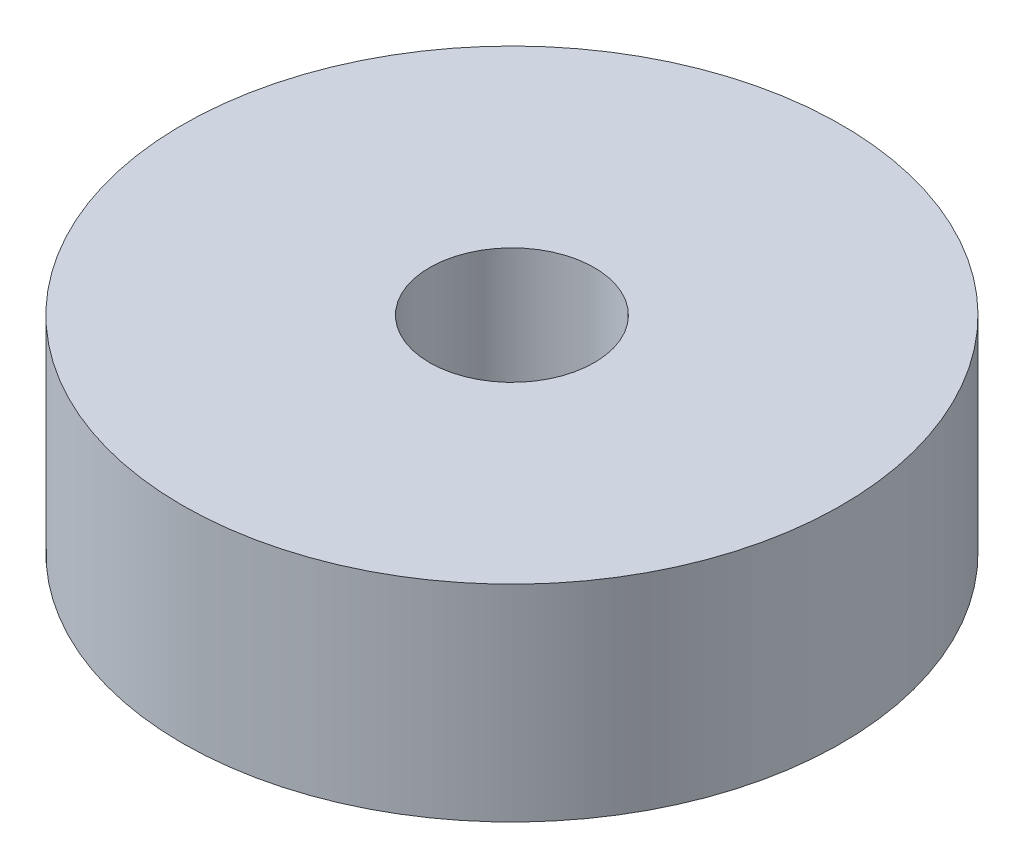
ISO-10303-21;
HEADER;
FILE_DESCRIPTION(('STEP AP214'),'2;1');
FILE_NAME('part.step','',(''),(''),'','','');
FILE_SCHEMA(('AUTOMOTIVE_DESIGN { 1 0 10303 214 1 1 1 1 }'));
ENDSEC;
DATA;
#1=APPLICATION_CONTEXT('core data for automotive mechanical design processes');
#2=APPLICATION_PROTOCOL_DEFINITION('international standard','automotive_design',2000,#1);
#3=PRODUCT_CONTEXT('',#1,'mechanical');
#4=PRODUCT('Part','Part','',(#3));
#5=PRODUCT_RELATED_PRODUCT_CATEGORY('part','',(#4));
#6=PRODUCT_DEFINITION_FORMATION('','',#4);
#7=PRODUCT_DEFINITION_CONTEXT('part definition',#1,'design');
#8=PRODUCT_DEFINITION('design','',#6,#7);
#9=PRODUCT_DEFINITION_SHAPE('','',#8);
#10=(LENGTH_UNIT() NAMED_UNIT(*) SI_UNIT(.MILLI.,.METRE.));
#11=(NAMED_UNIT(*) PLANE_ANGLE_UNIT() SI_UNIT($,.RADIAN.));
#12=(NAMED_UNIT(*) SI_UNIT($,.STERADIAN.) SOLID_ANGLE_UNIT());
#13=UNCERTAINTY_MEASURE_WITH_UNIT(LENGTH_MEASURE(1.E-05),#10,'distance_accuracy_value','');
#14=(GEOMETRIC_REPRESENTATION_CONTEXT(3) GLOBAL_UNCERTAINTY_ASSIGNED_CONTEXT((#13)) GLOBAL_UNIT_ASSIGNED_CONTEXT((#10,
#11,#12)) REPRESENTATION_CONTEXT('',''));
#15=CARTESIAN_POINT('',(0.,0.,0.));
#16=DIRECTION('',(0.,0.,1.));
#17=DIRECTION('',(1.,0.,0.));
#18=AXIS2_PLACEMENT_3D('',#15,#16,#17);
#19=CARTESIAN_POINT('',(0.,5.,0.));
#20=DIRECTION('',(0.,1.,0.));
#21=DIRECTION('',(0.,0.,1.));
#22=AXIS2_PLACEMENT_3D('',#19,#20,#21);
#23=PLANE('',#22);
#24=CARTESIAN_POINT('',(0.,5.,0.));
#25=DIRECTION('',(0.,1.,0.));
#26=DIRECTION('',(0.,0.,1.));
#27=AXIS2_PLACEMENT_3D('',#24,#25,#26);
#28=CIRCLE('',#27,8.);
#29=CARTESIAN_POINT('',(0.,5.,8.));
#30=VERTEX_POINT('',#29);
#31=EDGE_CURVE('E10',#30,#30,#28,.T.);
#32=ORIENTED_EDGE('',*,*,#31,.T.);
#33=EDGE_LOOP('',(#32));
#34=FACE_BOUND('',#33,.T.);
#35=CARTESIAN_POINT('',(0.,5.,0.));
#36=DIRECTION('',(0.,1.,0.));
#37=DIRECTION('',(0.,0.,1.));
#38=AXIS2_PLACEMENT_3D('',#35,#36,#37);
#39=CIRCLE('',#38,2.);
#40=CARTESIAN_POINT('',(0.,5.,2.));
#41=VERTEX_POINT('',#40);
#42=EDGE_CURVE('E42',#41,#41,#39,.T.);
#43=ORIENTED_EDGE('',*,*,#42,.F.);
#44=EDGE_LOOP('',(#43));
#45=FACE_BOUND('',#44,.T.);
#46=ADVANCED_FACE('F31',(#34,#45),#23,.T.);
#47=CARTESIAN_POINT('',(0.,0.,0.));
#48=DIRECTION('',(0.,1.,0.));
#49=DIRECTION('',(0.,0.,1.));
#50=AXIS2_PLACEMENT_3D('',#47,#48,#49);
#51=PLANE('',#50);
#52=CARTESIAN_POINT('',(0.,0.,0.));
#53=DIRECTION('',(0.,1.,0.));
#54=DIRECTION('',(0.,0.,1.));
#55=AXIS2_PLACEMENT_3D('',#52,#53,#54);
#56=CIRCLE('',#55,8.);
#57=CARTESIAN_POINT('',(0.,0.,8.));
#58=VERTEX_POINT('',#57);
#59=EDGE_CURVE('E35',#58,#58,#56,.T.);
#60=ORIENTED_EDGE('',*,*,#59,.F.);
#61=EDGE_LOOP('',(#60));
#62=FACE_BOUND('',#61,.T.);
#63=CARTESIAN_POINT('',(0.,0.,0.));
#64=DIRECTION('',(0.,1.,0.));
#65=DIRECTION('',(0.,0.,1.));
#66=AXIS2_PLACEMENT_3D('',#63,#64,#65);
#67=CIRCLE('',#66,2.);
#68=CARTESIAN_POINT('',(0.,0.,2.));
#69=VERTEX_POINT('',#68);
#70=EDGE_CURVE('E44',#69,#69,#67,.T.);
#71=ORIENTED_EDGE('',*,*,#70,.T.);
#72=EDGE_LOOP('',(#71));
#73=FACE_BOUND('',#72,.T.);
#74=ADVANCED_FACE('F54',(#62,#73),#51,.F.);
#75=CARTESIAN_POINT('',(0.,5.,0.));
#76=DIRECTION('',(0.,-1.,0.));
#77=DIRECTION('',(0.,0.,-1.));
#78=AXIS2_PLACEMENT_3D('',#75,#76,#77);
#79=CYLINDRICAL_SURFACE('',#78,8.);
#80=ORIENTED_EDGE('',*,*,#31,.F.);
#81=EDGE_LOOP('',(#80));
#82=FACE_BOUND('',#81,.T.);
#83=ORIENTED_EDGE('',*,*,#59,.T.);
#84=EDGE_LOOP('',(#83));
#85=FACE_BOUND('',#84,.T.);
#86=ADVANCED_FACE('F33',(#82,#85),#79,.T.);
#87=CARTESIAN_POINT('',(0.,5.,0.));
#88=DIRECTION('',(0.,-1.,0.));
#89=DIRECTION('',(0.,0.,-1.));
#90=AXIS2_PLACEMENT_3D('',#87,#88,#89);
#91=CYLINDRICAL_SURFACE('',#90,2.);
#92=ORIENTED_EDGE('',*,*,#42,.T.);
#93=EDGE_LOOP('',(#92));
#94=FACE_BOUND('',#93,.T.);
#95=ORIENTED_EDGE('',*,*,#70,.F.);
#96=EDGE_LOOP('',(#95));
#97=FACE_BOUND('',#96,.T.);
#98=ADVANCED_FACE('F50',(#94,#97),#91,.F.);
#99=CLOSED_SHELL('',(#46,#74,#86,#98));
#100=MANIFOLD_SOLID_BREP('B2',#99);
#101=ADVANCED_BREP_SHAPE_REPRESENTATION('',(#18,#100),#14);
#102=SHAPE_DEFINITION_REPRESENTATION(#9,#101);
ENDSEC;
END-ISO-10303-21;
